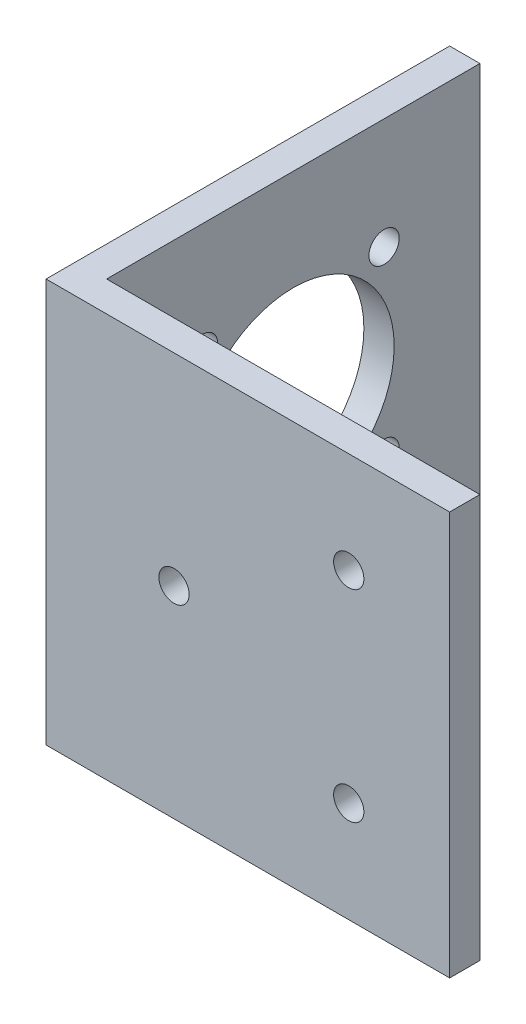
ISO-10303-21;
HEADER;
FILE_DESCRIPTION(('STEP AP214'),'2;1');
FILE_NAME('part.step','',(''),(''),'','','');
FILE_SCHEMA(('AUTOMOTIVE_DESIGN { 1 0 10303 214 1 1 1 1 }'));
ENDSEC;
DATA;
#1=APPLICATION_CONTEXT('core data for automotive mechanical design processes');
#2=APPLICATION_PROTOCOL_DEFINITION('international standard','automotive_design',2000,#1);
#3=PRODUCT_CONTEXT('',#1,'mechanical');
#4=PRODUCT('Part','Part','',(#3));
#5=PRODUCT_RELATED_PRODUCT_CATEGORY('part','',(#4));
#6=PRODUCT_DEFINITION_FORMATION('','',#4);
#7=PRODUCT_DEFINITION_CONTEXT('part definition',#1,'design');
#8=PRODUCT_DEFINITION('design','',#6,#7);
#9=PRODUCT_DEFINITION_SHAPE('','',#8);
#10=(LENGTH_UNIT() NAMED_UNIT(*) SI_UNIT(.MILLI.,.METRE.));
#11=(NAMED_UNIT(*) PLANE_ANGLE_UNIT() SI_UNIT($,.RADIAN.));
#12=(NAMED_UNIT(*) SI_UNIT($,.STERADIAN.) SOLID_ANGLE_UNIT());
#13=UNCERTAINTY_MEASURE_WITH_UNIT(LENGTH_MEASURE(1.E-05),#10,'distance_accuracy_value','');
#14=(GEOMETRIC_REPRESENTATION_CONTEXT(3) GLOBAL_UNCERTAINTY_ASSIGNED_CONTEXT((#13)) GLOBAL_UNIT_ASSIGNED_CONTEXT((#10,
#11,#12)) REPRESENTATION_CONTEXT('',''));
#15=CARTESIAN_POINT('',(0.,0.,0.));
#16=DIRECTION('',(0.,0.,1.));
#17=DIRECTION('',(1.,0.,0.));
#18=AXIS2_PLACEMENT_3D('',#15,#16,#17);
#19=CARTESIAN_POINT('',(0.,40.,-40.));
#20=DIRECTION('',(1.,0.,0.));
#21=DIRECTION('',(0.,0.,-1.));
#22=AXIS2_PLACEMENT_3D('',#19,#20,#21);
#23=PLANE('',#22);
#24=CARTESIAN_POINT('',(0.,29.,-12.5));
#25=DIRECTION('',(1.,0.,0.));
#26=DIRECTION('',(0.,0.,-1.));
#27=AXIS2_PLACEMENT_3D('',#24,#25,#26);
#28=CIRCLE('',#27,1.5);
#29=CARTESIAN_POINT('',(0.,29.,-14.));
#30=VERTEX_POINT('',#29);
#31=EDGE_CURVE('E124',#30,#30,#28,.T.);
#32=ORIENTED_EDGE('',*,*,#31,.T.);
#33=EDGE_LOOP('',(#32));
#34=FACE_BOUND('',#33,.T.);
#35=CARTESIAN_POINT('',(0.,11.,-12.5));
#36=DIRECTION('',(1.,0.,0.));
#37=DIRECTION('',(0.,0.,-1.));
#38=AXIS2_PLACEMENT_3D('',#35,#36,#37);
#39=CIRCLE('',#38,1.5);
#40=CARTESIAN_POINT('',(0.,11.,-14.));
#41=VERTEX_POINT('',#40);
#42=EDGE_CURVE('E169',#41,#41,#39,.T.);
#43=ORIENTED_EDGE('',*,*,#42,.T.);
#44=EDGE_LOOP('',(#43));
#45=FACE_BOUND('',#44,.T.);
#46=CARTESIAN_POINT('',(0.,11.,-30.5));
#47=DIRECTION('',(1.,0.,0.));
#48=DIRECTION('',(0.,0.,-1.));
#49=AXIS2_PLACEMENT_3D('',#46,#47,#48);
#50=CIRCLE('',#49,1.5);
#51=CARTESIAN_POINT('',(0.,11.,-32.));
#52=VERTEX_POINT('',#51);
#53=EDGE_CURVE('E173',#52,#52,#50,.T.);
#54=ORIENTED_EDGE('',*,*,#53,.T.);
#55=EDGE_LOOP('',(#54));
#56=FACE_BOUND('',#55,.T.);
#57=CARTESIAN_POINT('',(0.,29.,-30.5));
#58=DIRECTION('',(1.,0.,0.));
#59=DIRECTION('',(0.,0.,-1.));
#60=AXIS2_PLACEMENT_3D('',#57,#58,#59);
#61=CIRCLE('',#60,1.5);
#62=CARTESIAN_POINT('',(0.,29.,-32.));
#63=VERTEX_POINT('',#62);
#64=EDGE_CURVE('E177',#63,#63,#61,.T.);
#65=ORIENTED_EDGE('',*,*,#64,.T.);
#66=EDGE_LOOP('',(#65));
#67=FACE_BOUND('',#66,.T.);
#68=CARTESIAN_POINT('',(0.,20.,-21.5));
#69=DIRECTION('',(1.,0.,0.));
#70=DIRECTION('',(0.,0.,-1.));
#71=AXIS2_PLACEMENT_3D('',#68,#69,#70);
#72=CIRCLE('',#71,10.);
#73=CARTESIAN_POINT('',(0.,20.,-31.5));
#74=VERTEX_POINT('',#73);
#75=EDGE_CURVE('E180',#74,#74,#72,.T.);
#76=ORIENTED_EDGE('',*,*,#75,.T.);
#77=EDGE_LOOP('',(#76));
#78=FACE_BOUND('',#77,.T.);
#79=DIRECTION('',(0.,0.,1.));
#80=VECTOR('',#79,1.);
#81=CARTESIAN_POINT('',(0.,0.,-40.));
#82=LINE('',#81,#80);
#83=CARTESIAN_POINT('',(0.,0.,-40.));
#84=VERTEX_POINT('',#83);
#85=CARTESIAN_POINT('',(0.,0.,0.));
#86=VERTEX_POINT('',#85);
#87=EDGE_CURVE('E120',#84,#86,#82,.T.);
#88=ORIENTED_EDGE('',*,*,#87,.T.);
#89=DIRECTION('',(0.,-1.,0.));
#90=VECTOR('',#89,1.);
#91=CARTESIAN_POINT('',(0.,40.,0.));
#92=LINE('',#91,#90);
#93=CARTESIAN_POINT('',(0.,40.,0.));
#94=VERTEX_POINT('',#93);
#95=EDGE_CURVE('E11',#94,#86,#92,.T.);
#96=ORIENTED_EDGE('',*,*,#95,.F.);
#97=DIRECTION('',(0.,0.,1.));
#98=VECTOR('',#97,1.);
#99=CARTESIAN_POINT('',(0.,40.,-40.));
#100=LINE('',#99,#98);
#101=CARTESIAN_POINT('',(0.,40.,-40.));
#102=VERTEX_POINT('',#101);
#103=EDGE_CURVE('E131',#102,#94,#100,.T.);
#104=ORIENTED_EDGE('',*,*,#103,.F.);
#105=DIRECTION('',(0.,-1.,0.));
#106=VECTOR('',#105,1.);
#107=CARTESIAN_POINT('',(0.,40.,-40.));
#108=LINE('',#107,#106);
#109=EDGE_CURVE('E116',#102,#84,#108,.T.);
#110=ORIENTED_EDGE('',*,*,#109,.T.);
#111=EDGE_LOOP('',(#88,#96,#104,#110));
#112=FACE_BOUND('',#111,.T.);
#113=ADVANCED_FACE('F36',(#34,#45,#56,#67,#78,#112),#23,.F.);
#114=CARTESIAN_POINT('',(0.,40.,0.));
#115=DIRECTION('',(0.,0.,-1.));
#116=DIRECTION('',(-1.,0.,0.));
#117=AXIS2_PLACEMENT_3D('',#114,#115,#116);
#118=PLANE('',#117);
#119=CARTESIAN_POINT('',(30.,30.,0.));
#120=DIRECTION('',(0.,0.,-1.));
#121=DIRECTION('',(-1.,0.,0.));
#122=AXIS2_PLACEMENT_3D('',#119,#120,#121);
#123=CIRCLE('',#122,1.5);
#124=CARTESIAN_POINT('',(28.5,30.,0.));
#125=VERTEX_POINT('',#124);
#126=EDGE_CURVE('E198',#125,#125,#123,.T.);
#127=ORIENTED_EDGE('',*,*,#126,.T.);
#128=EDGE_LOOP('',(#127));
#129=FACE_BOUND('',#128,.T.);
#130=CARTESIAN_POINT('',(12.6794919243111,20.,0.));
#131=DIRECTION('',(0.,0.,-1.));
#132=DIRECTION('',(-1.,0.,0.));
#133=AXIS2_PLACEMENT_3D('',#130,#131,#132);
#134=CIRCLE('',#133,1.49999999999996);
#135=CARTESIAN_POINT('',(11.1794919243112,20.,0.));
#136=VERTEX_POINT('',#135);
#137=EDGE_CURVE('E215',#136,#136,#134,.T.);
#138=ORIENTED_EDGE('',*,*,#137,.T.);
#139=EDGE_LOOP('',(#138));
#140=FACE_BOUND('',#139,.T.);
#141=CARTESIAN_POINT('',(30.,10.,0.));
#142=DIRECTION('',(0.,0.,-1.));
#143=DIRECTION('',(-1.,0.,0.));
#144=AXIS2_PLACEMENT_3D('',#141,#142,#143);
#145=CIRCLE('',#144,1.5);
#146=CARTESIAN_POINT('',(28.5,10.,0.));
#147=VERTEX_POINT('',#146);
#148=EDGE_CURVE('E209',#147,#147,#145,.T.);
#149=ORIENTED_EDGE('',*,*,#148,.T.);
#150=EDGE_LOOP('',(#149));
#151=FACE_BOUND('',#150,.T.);
#152=DIRECTION('',(1.,0.,0.));
#153=VECTOR('',#152,1.);
#154=CARTESIAN_POINT('',(0.,0.,0.));
#155=LINE('',#154,#153);
#156=CARTESIAN_POINT('',(40.,0.,0.));
#157=VERTEX_POINT('',#156);
#158=EDGE_CURVE('E123',#86,#157,#155,.T.);
#159=ORIENTED_EDGE('',*,*,#158,.T.);
#160=DIRECTION('',(0.,-1.,0.));
#161=VECTOR('',#160,1.);
#162=CARTESIAN_POINT('',(40.,40.,0.));
#163=LINE('',#162,#161);
#164=CARTESIAN_POINT('',(40.,40.,0.));
#165=VERTEX_POINT('',#164);
#166=EDGE_CURVE('E44',#165,#157,#163,.T.);
#167=ORIENTED_EDGE('',*,*,#166,.F.);
#168=DIRECTION('',(1.,0.,0.));
#169=VECTOR('',#168,1.);
#170=CARTESIAN_POINT('',(0.,40.,0.));
#171=LINE('',#170,#169);
#172=EDGE_CURVE('E89',#94,#165,#171,.T.);
#173=ORIENTED_EDGE('',*,*,#172,.F.);
#174=ORIENTED_EDGE('',*,*,#95,.T.);
#175=EDGE_LOOP('',(#159,#167,#173,#174));
#176=FACE_BOUND('',#175,.T.);
#177=ADVANCED_FACE('F156',(#129,#140,#151,#176),#118,.F.);
#178=CARTESIAN_POINT('',(40.,40.,0.));
#179=DIRECTION('',(-1.,0.,0.));
#180=DIRECTION('',(0.,0.,1.));
#181=AXIS2_PLACEMENT_3D('',#178,#179,#180);
#182=PLANE('',#181);
#183=DIRECTION('',(0.,0.,-1.));
#184=VECTOR('',#183,1.);
#185=CARTESIAN_POINT('',(40.,0.,0.));
#186=LINE('',#185,#184);
#187=CARTESIAN_POINT('',(40.,0.,-3.));
#188=VERTEX_POINT('',#187);
#189=EDGE_CURVE('E126',#157,#188,#186,.T.);
#190=ORIENTED_EDGE('',*,*,#189,.T.);
#191=DIRECTION('',(0.,-1.,0.));
#192=VECTOR('',#191,1.);
#193=CARTESIAN_POINT('',(40.,40.,-3.));
#194=LINE('',#193,#192);
#195=CARTESIAN_POINT('',(40.,40.,-3.));
#196=VERTEX_POINT('',#195);
#197=EDGE_CURVE('E111',#196,#188,#194,.T.);
#198=ORIENTED_EDGE('',*,*,#197,.F.);
#199=DIRECTION('',(0.,0.,-1.));
#200=VECTOR('',#199,1.);
#201=CARTESIAN_POINT('',(40.,40.,0.));
#202=LINE('',#201,#200);
#203=EDGE_CURVE('E102',#165,#196,#202,.T.);
#204=ORIENTED_EDGE('',*,*,#203,.F.);
#205=ORIENTED_EDGE('',*,*,#166,.T.);
#206=EDGE_LOOP('',(#190,#198,#204,#205));
#207=FACE_BOUND('',#206,.T.);
#208=ADVANCED_FACE('F137',(#207),#182,.F.);
#209=CARTESIAN_POINT('',(40.,40.,-3.));
#210=DIRECTION('',(0.,0.,1.));
#211=DIRECTION('',(1.,0.,0.));
#212=AXIS2_PLACEMENT_3D('',#209,#210,#211);
#213=PLANE('',#212);
#214=CARTESIAN_POINT('',(30.,30.,-3.));
#215=DIRECTION('',(0.,0.,-1.));
#216=DIRECTION('',(-1.,0.,0.));
#217=AXIS2_PLACEMENT_3D('',#214,#215,#216);
#218=CIRCLE('',#217,1.5);
#219=CARTESIAN_POINT('',(28.5,30.,-3.));
#220=VERTEX_POINT('',#219);
#221=EDGE_CURVE('E218',#220,#220,#218,.T.);
#222=ORIENTED_EDGE('',*,*,#221,.F.);
#223=EDGE_LOOP('',(#222));
#224=FACE_BOUND('',#223,.T.);
#225=CARTESIAN_POINT('',(12.6794919243111,20.,-3.));
#226=DIRECTION('',(0.,0.,-1.));
#227=DIRECTION('',(-1.,0.,0.));
#228=AXIS2_PLACEMENT_3D('',#225,#226,#227);
#229=CIRCLE('',#228,1.49999999999996);
#230=CARTESIAN_POINT('',(11.1794919243112,20.,-3.));
#231=VERTEX_POINT('',#230);
#232=EDGE_CURVE('E212',#231,#231,#229,.T.);
#233=ORIENTED_EDGE('',*,*,#232,.F.);
#234=EDGE_LOOP('',(#233));
#235=FACE_BOUND('',#234,.T.);
#236=CARTESIAN_POINT('',(30.,10.,-3.));
#237=DIRECTION('',(0.,0.,-1.));
#238=DIRECTION('',(-1.,0.,0.));
#239=AXIS2_PLACEMENT_3D('',#236,#237,#238);
#240=CIRCLE('',#239,1.5);
#241=CARTESIAN_POINT('',(28.5,10.,-3.));
#242=VERTEX_POINT('',#241);
#243=EDGE_CURVE('E206',#242,#242,#240,.T.);
#244=ORIENTED_EDGE('',*,*,#243,.F.);
#245=EDGE_LOOP('',(#244));
#246=FACE_BOUND('',#245,.T.);
#247=DIRECTION('',(-1.,0.,0.));
#248=VECTOR('',#247,1.);
#249=CARTESIAN_POINT('',(40.,0.,-3.));
#250=LINE('',#249,#248);
#251=CARTESIAN_POINT('',(3.,0.,-3.));
#252=VERTEX_POINT('',#251);
#253=EDGE_CURVE('E110',#188,#252,#250,.T.);
#254=ORIENTED_EDGE('',*,*,#253,.T.);
#255=DIRECTION('',(0.,-1.,0.));
#256=VECTOR('',#255,1.);
#257=CARTESIAN_POINT('',(3.,40.,-3.));
#258=LINE('',#257,#256);
#259=CARTESIAN_POINT('',(3.,40.,-3.));
#260=VERTEX_POINT('',#259);
#261=EDGE_CURVE('E107',#260,#252,#258,.T.);
#262=ORIENTED_EDGE('',*,*,#261,.F.);
#263=DIRECTION('',(-1.,0.,0.));
#264=VECTOR('',#263,1.);
#265=CARTESIAN_POINT('',(40.,40.,-3.));
#266=LINE('',#265,#264);
#267=EDGE_CURVE('E96',#196,#260,#266,.T.);
#268=ORIENTED_EDGE('',*,*,#267,.F.);
#269=ORIENTED_EDGE('',*,*,#197,.T.);
#270=EDGE_LOOP('',(#254,#262,#268,#269));
#271=FACE_BOUND('',#270,.T.);
#272=ADVANCED_FACE('F108',(#224,#235,#246,#271),#213,.F.);
#273=CARTESIAN_POINT('',(3.,40.,-3.));
#274=DIRECTION('',(-1.,0.,0.));
#275=DIRECTION('',(0.,0.,1.));
#276=AXIS2_PLACEMENT_3D('',#273,#274,#275);
#277=PLANE('',#276);
#278=CARTESIAN_POINT('',(3.,29.,-12.5));
#279=DIRECTION('',(1.,0.,0.));
#280=DIRECTION('',(0.,0.,-1.));
#281=AXIS2_PLACEMENT_3D('',#278,#279,#280);
#282=CIRCLE('',#281,1.5);
#283=CARTESIAN_POINT('',(3.,29.,-14.));
#284=VERTEX_POINT('',#283);
#285=EDGE_CURVE('E194',#284,#284,#282,.T.);
#286=ORIENTED_EDGE('',*,*,#285,.F.);
#287=EDGE_LOOP('',(#286));
#288=FACE_BOUND('',#287,.T.);
#289=CARTESIAN_POINT('',(3.,11.,-12.5));
#290=DIRECTION('',(1.,0.,0.));
#291=DIRECTION('',(0.,0.,-1.));
#292=AXIS2_PLACEMENT_3D('',#289,#290,#291);
#293=CIRCLE('',#292,1.5);
#294=CARTESIAN_POINT('',(3.,11.,-14.));
#295=VERTEX_POINT('',#294);
#296=EDGE_CURVE('E197',#295,#295,#293,.T.);
#297=ORIENTED_EDGE('',*,*,#296,.F.);
#298=EDGE_LOOP('',(#297));
#299=FACE_BOUND('',#298,.T.);
#300=CARTESIAN_POINT('',(3.,11.,-30.5));
#301=DIRECTION('',(1.,0.,0.));
#302=DIRECTION('',(0.,0.,-1.));
#303=AXIS2_PLACEMENT_3D('',#300,#301,#302);
#304=CIRCLE('',#303,1.5);
#305=CARTESIAN_POINT('',(3.,11.,-32.));
#306=VERTEX_POINT('',#305);
#307=EDGE_CURVE('E201',#306,#306,#304,.T.);
#308=ORIENTED_EDGE('',*,*,#307,.F.);
#309=EDGE_LOOP('',(#308));
#310=FACE_BOUND('',#309,.T.);
#311=CARTESIAN_POINT('',(3.,29.,-30.5));
#312=DIRECTION('',(1.,0.,0.));
#313=DIRECTION('',(0.,0.,-1.));
#314=AXIS2_PLACEMENT_3D('',#311,#312,#313);
#315=CIRCLE('',#314,1.5);
#316=CARTESIAN_POINT('',(3.,29.,-32.));
#317=VERTEX_POINT('',#316);
#318=EDGE_CURVE('E186',#317,#317,#315,.T.);
#319=ORIENTED_EDGE('',*,*,#318,.F.);
#320=EDGE_LOOP('',(#319));
#321=FACE_BOUND('',#320,.T.);
#322=CARTESIAN_POINT('',(3.,20.,-21.5));
#323=DIRECTION('',(1.,0.,0.));
#324=DIRECTION('',(0.,0.,-1.));
#325=AXIS2_PLACEMENT_3D('',#322,#323,#324);
#326=CIRCLE('',#325,10.);
#327=CARTESIAN_POINT('',(3.,20.,-31.5));
#328=VERTEX_POINT('',#327);
#329=EDGE_CURVE('E182',#328,#328,#326,.T.);
#330=ORIENTED_EDGE('',*,*,#329,.F.);
#331=EDGE_LOOP('',(#330));
#332=FACE_BOUND('',#331,.T.);
#333=DIRECTION('',(0.,0.,-1.));
#334=VECTOR('',#333,1.);
#335=CARTESIAN_POINT('',(3.,0.,-3.));
#336=LINE('',#335,#334);
#337=CARTESIAN_POINT('',(3.,0.,-40.));
#338=VERTEX_POINT('',#337);
#339=EDGE_CURVE('E75',#252,#338,#336,.T.);
#340=ORIENTED_EDGE('',*,*,#339,.T.);
#341=DIRECTION('',(0.,-1.,0.));
#342=VECTOR('',#341,1.);
#343=CARTESIAN_POINT('',(3.,40.,-40.));
#344=LINE('',#343,#342);
#345=CARTESIAN_POINT('',(3.,40.,-40.));
#346=VERTEX_POINT('',#345);
#347=EDGE_CURVE('E112',#346,#338,#344,.T.);
#348=ORIENTED_EDGE('',*,*,#347,.F.);
#349=DIRECTION('',(0.,0.,-1.));
#350=VECTOR('',#349,1.);
#351=CARTESIAN_POINT('',(3.,40.,-3.));
#352=LINE('',#351,#350);
#353=EDGE_CURVE('E100',#260,#346,#352,.T.);
#354=ORIENTED_EDGE('',*,*,#353,.F.);
#355=ORIENTED_EDGE('',*,*,#261,.T.);
#356=EDGE_LOOP('',(#340,#348,#354,#355));
#357=FACE_BOUND('',#356,.T.);
#358=ADVANCED_FACE('F114',(#288,#299,#310,#321,#332,#357),#277,.F.);
#359=CARTESIAN_POINT('',(3.,40.,-40.));
#360=DIRECTION('',(0.,0.,1.));
#361=DIRECTION('',(1.,0.,0.));
#362=AXIS2_PLACEMENT_3D('',#359,#360,#361);
#363=PLANE('',#362);
#364=DIRECTION('',(-1.,0.,0.));
#365=VECTOR('',#364,1.);
#366=CARTESIAN_POINT('',(3.,0.,-40.));
#367=LINE('',#366,#365);
#368=EDGE_CURVE('E81',#338,#84,#367,.T.);
#369=ORIENTED_EDGE('',*,*,#368,.T.);
#370=ORIENTED_EDGE('',*,*,#109,.F.);
#371=DIRECTION('',(-1.,0.,0.));
#372=VECTOR('',#371,1.);
#373=CARTESIAN_POINT('',(3.,40.,-40.));
#374=LINE('',#373,#372);
#375=EDGE_CURVE('E52',#346,#102,#374,.T.);
#376=ORIENTED_EDGE('',*,*,#375,.F.);
#377=ORIENTED_EDGE('',*,*,#347,.T.);
#378=EDGE_LOOP('',(#369,#370,#376,#377));
#379=FACE_BOUND('',#378,.T.);
#380=ADVANCED_FACE('F144',(#379),#363,.F.);
#381=CARTESIAN_POINT('',(0.,40.,0.));
#382=DIRECTION('',(0.,1.,0.));
#383=DIRECTION('',(0.,0.,1.));
#384=AXIS2_PLACEMENT_3D('',#381,#382,#383);
#385=PLANE('',#384);
#386=ORIENTED_EDGE('',*,*,#103,.T.);
#387=ORIENTED_EDGE('',*,*,#172,.T.);
#388=ORIENTED_EDGE('',*,*,#203,.T.);
#389=ORIENTED_EDGE('',*,*,#267,.T.);
#390=ORIENTED_EDGE('',*,*,#353,.T.);
#391=ORIENTED_EDGE('',*,*,#375,.T.);
#392=EDGE_LOOP('',(#386,#387,#388,#389,#390,#391));
#393=FACE_BOUND('',#392,.T.);
#394=ADVANCED_FACE('F98',(#393),#385,.T.);
#395=CARTESIAN_POINT('',(0.,0.,0.));
#396=DIRECTION('',(0.,1.,0.));
#397=DIRECTION('',(0.,0.,1.));
#398=AXIS2_PLACEMENT_3D('',#395,#396,#397);
#399=PLANE('',#398);
#400=ORIENTED_EDGE('',*,*,#87,.F.);
#401=ORIENTED_EDGE('',*,*,#368,.F.);
#402=ORIENTED_EDGE('',*,*,#339,.F.);
#403=ORIENTED_EDGE('',*,*,#253,.F.);
#404=ORIENTED_EDGE('',*,*,#189,.F.);
#405=ORIENTED_EDGE('',*,*,#158,.F.);
#406=EDGE_LOOP('',(#400,#401,#402,#403,#404,#405));
#407=FACE_BOUND('',#406,.T.);
#408=ADVANCED_FACE('F140',(#407),#399,.F.);
#409=CARTESIAN_POINT('',(-37.,20.,-21.5));
#410=DIRECTION('',(1.,0.,0.));
#411=DIRECTION('',(0.,0.,-1.));
#412=AXIS2_PLACEMENT_3D('',#409,#410,#411);
#413=CYLINDRICAL_SURFACE('',#412,10.);
#414=ORIENTED_EDGE('',*,*,#329,.T.);
#415=EDGE_LOOP('',(#414));
#416=FACE_BOUND('',#415,.T.);
#417=ORIENTED_EDGE('',*,*,#75,.F.);
#418=EDGE_LOOP('',(#417));
#419=FACE_BOUND('',#418,.T.);
#420=ADVANCED_FACE('F259',(#416,#419),#413,.F.);
#421=CARTESIAN_POINT('',(-37.,29.,-30.5));
#422=DIRECTION('',(1.,0.,0.));
#423=DIRECTION('',(0.,0.,-1.));
#424=AXIS2_PLACEMENT_3D('',#421,#422,#423);
#425=CYLINDRICAL_SURFACE('',#424,1.5);
#426=ORIENTED_EDGE('',*,*,#318,.T.);
#427=EDGE_LOOP('',(#426));
#428=FACE_BOUND('',#427,.T.);
#429=ORIENTED_EDGE('',*,*,#64,.F.);
#430=EDGE_LOOP('',(#429));
#431=FACE_BOUND('',#430,.T.);
#432=ADVANCED_FACE('F255',(#428,#431),#425,.F.);
#433=CARTESIAN_POINT('',(-37.,11.,-30.5));
#434=DIRECTION('',(1.,0.,0.));
#435=DIRECTION('',(0.,0.,-1.));
#436=AXIS2_PLACEMENT_3D('',#433,#434,#435);
#437=CYLINDRICAL_SURFACE('',#436,1.5);
#438=ORIENTED_EDGE('',*,*,#307,.T.);
#439=EDGE_LOOP('',(#438));
#440=FACE_BOUND('',#439,.T.);
#441=ORIENTED_EDGE('',*,*,#53,.F.);
#442=EDGE_LOOP('',(#441));
#443=FACE_BOUND('',#442,.T.);
#444=ADVANCED_FACE('F258',(#440,#443),#437,.F.);
#445=CARTESIAN_POINT('',(-37.,11.,-12.5));
#446=DIRECTION('',(1.,0.,0.));
#447=DIRECTION('',(0.,0.,-1.));
#448=AXIS2_PLACEMENT_3D('',#445,#446,#447);
#449=CYLINDRICAL_SURFACE('',#448,1.5);
#450=ORIENTED_EDGE('',*,*,#296,.T.);
#451=EDGE_LOOP('',(#450));
#452=FACE_BOUND('',#451,.T.);
#453=ORIENTED_EDGE('',*,*,#42,.F.);
#454=EDGE_LOOP('',(#453));
#455=FACE_BOUND('',#454,.T.);
#456=ADVANCED_FACE('F250',(#452,#455),#449,.F.);
#457=CARTESIAN_POINT('',(-37.,29.,-12.5));
#458=DIRECTION('',(1.,0.,0.));
#459=DIRECTION('',(0.,0.,-1.));
#460=AXIS2_PLACEMENT_3D('',#457,#458,#459);
#461=CYLINDRICAL_SURFACE('',#460,1.5);
#462=ORIENTED_EDGE('',*,*,#285,.T.);
#463=EDGE_LOOP('',(#462));
#464=FACE_BOUND('',#463,.T.);
#465=ORIENTED_EDGE('',*,*,#31,.F.);
#466=EDGE_LOOP('',(#465));
#467=FACE_BOUND('',#466,.T.);
#468=ADVANCED_FACE('F241',(#464,#467),#461,.F.);
#469=CARTESIAN_POINT('',(30.,10.,0.));
#470=DIRECTION('',(0.,0.,-1.));
#471=DIRECTION('',(-1.,0.,0.));
#472=AXIS2_PLACEMENT_3D('',#469,#470,#471);
#473=CYLINDRICAL_SURFACE('',#472,1.5);
#474=ORIENTED_EDGE('',*,*,#148,.F.);
#475=EDGE_LOOP('',(#474));
#476=FACE_BOUND('',#475,.T.);
#477=ORIENTED_EDGE('',*,*,#243,.T.);
#478=EDGE_LOOP('',(#477));
#479=FACE_BOUND('',#478,.T.);
#480=ADVANCED_FACE('F239',(#476,#479),#473,.F.);
#481=CARTESIAN_POINT('',(12.6794919243111,20.,0.));
#482=DIRECTION('',(0.,0.,-1.));
#483=DIRECTION('',(-1.,0.,0.));
#484=AXIS2_PLACEMENT_3D('',#481,#482,#483);
#485=CYLINDRICAL_SURFACE('',#484,1.49999999999996);
#486=ORIENTED_EDGE('',*,*,#137,.F.);
#487=EDGE_LOOP('',(#486));
#488=FACE_BOUND('',#487,.T.);
#489=ORIENTED_EDGE('',*,*,#232,.T.);
#490=EDGE_LOOP('',(#489));
#491=FACE_BOUND('',#490,.T.);
#492=ADVANCED_FACE('F228',(#488,#491),#485,.F.);
#493=CARTESIAN_POINT('',(30.,30.,0.));
#494=DIRECTION('',(0.,0.,-1.));
#495=DIRECTION('',(-1.,0.,0.));
#496=AXIS2_PLACEMENT_3D('',#493,#494,#495);
#497=CYLINDRICAL_SURFACE('',#496,1.5);
#498=ORIENTED_EDGE('',*,*,#126,.F.);
#499=EDGE_LOOP('',(#498));
#500=FACE_BOUND('',#499,.T.);
#501=ORIENTED_EDGE('',*,*,#221,.T.);
#502=EDGE_LOOP('',(#501));
#503=FACE_BOUND('',#502,.T.);
#504=ADVANCED_FACE('F225',(#500,#503),#497,.F.);
#505=CLOSED_SHELL('',(#113,#177,#208,#272,#358,#380,#394,#408,#420,#432,#444,#456,#468,#480,
#492,#504));
#506=MANIFOLD_SOLID_BREP('B2',#505);
#507=ADVANCED_BREP_SHAPE_REPRESENTATION('',(#18,#506),#14);
#508=SHAPE_DEFINITION_REPRESENTATION(#9,#507);
ENDSEC;
END-ISO-10303-21;
